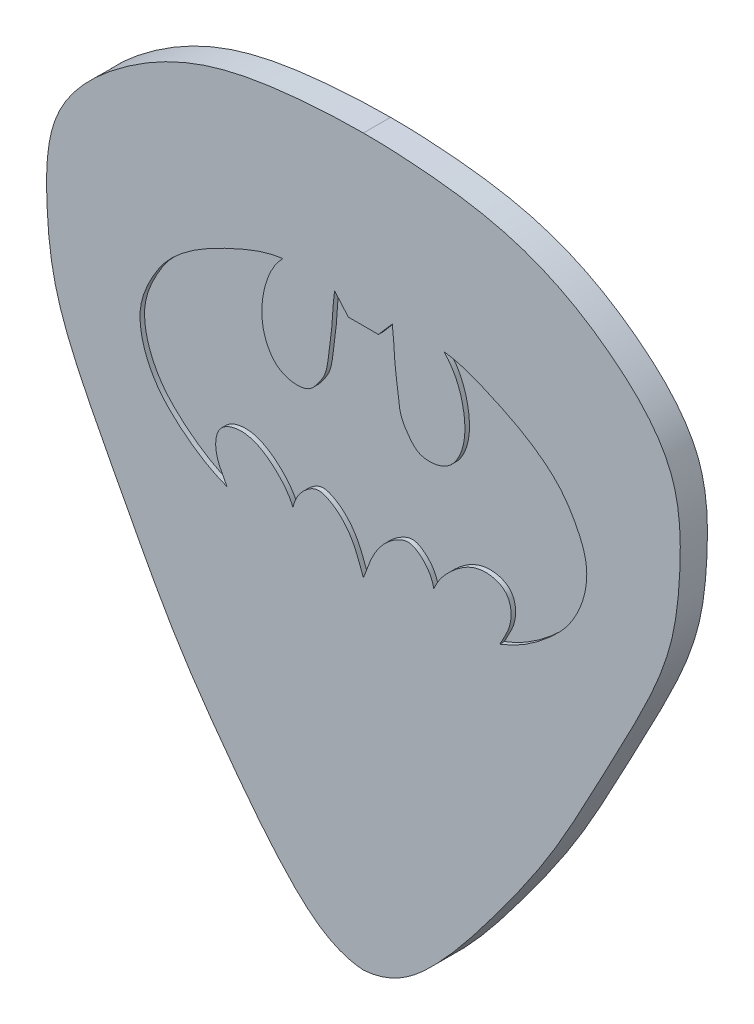
ISO-10303-21;
HEADER;
FILE_DESCRIPTION(('STEP AP214'),'2;1');
FILE_NAME('part.step','',(''),(''),'','','');
FILE_SCHEMA(('AUTOMOTIVE_DESIGN { 1 0 10303 214 1 1 1 1 }'));
ENDSEC;
DATA;
#1=APPLICATION_CONTEXT('core data for automotive mechanical design processes');
#2=APPLICATION_PROTOCOL_DEFINITION('international standard','automotive_design',2000,#1);
#3=PRODUCT_CONTEXT('',#1,'mechanical');
#4=PRODUCT('Part','Part','',(#3));
#5=PRODUCT_RELATED_PRODUCT_CATEGORY('part','',(#4));
#6=PRODUCT_DEFINITION_FORMATION('','',#4);
#7=PRODUCT_DEFINITION_CONTEXT('part definition',#1,'design');
#8=PRODUCT_DEFINITION('design','',#6,#7);
#9=PRODUCT_DEFINITION_SHAPE('','',#8);
#10=(LENGTH_UNIT() NAMED_UNIT(*) SI_UNIT(.MILLI.,.METRE.));
#11=(NAMED_UNIT(*) PLANE_ANGLE_UNIT() SI_UNIT($,.RADIAN.));
#12=(NAMED_UNIT(*) SI_UNIT($,.STERADIAN.) SOLID_ANGLE_UNIT());
#13=UNCERTAINTY_MEASURE_WITH_UNIT(LENGTH_MEASURE(1.E-05),#10,'distance_accuracy_value','');
#14=(GEOMETRIC_REPRESENTATION_CONTEXT(3) GLOBAL_UNCERTAINTY_ASSIGNED_CONTEXT((#13)) GLOBAL_UNIT_ASSIGNED_CONTEXT((#10,
#11,#12)) REPRESENTATION_CONTEXT('',''));
#15=CARTESIAN_POINT('',(0.,0.,0.));
#16=DIRECTION('',(0.,0.,1.));
#17=DIRECTION('',(1.,0.,0.));
#18=AXIS2_PLACEMENT_3D('',#15,#16,#17);
#19=CARTESIAN_POINT('',(13.2868793034782,18.3555837663293,1.2));
#20=DIRECTION('',(0.,0.,-1.));
#21=DIRECTION('',(-1.,0.,0.));
#22=AXIS2_PLACEMENT_3D('',#19,#20,#21);
#23=PLANE('',#22);
#24=CARTESIAN_POINT('',(0.,0.,1.2));
#25=CARTESIAN_POINT('',(1.3725179585471,0.0920720774433055,1.2));
#26=CARTESIAN_POINT('',(3.40311330723531,1.84725696244432,1.2));
#27=CARTESIAN_POINT('',(5.83377601303966,4.9969359267709,1.2));
#28=CARTESIAN_POINT('',(8.30396753302915,8.43054929060509,1.2));
#29=CARTESIAN_POINT('',(10.213558633326,12.0661802752507,1.2));
#30=CARTESIAN_POINT('',(12.1318717474483,15.6564896058509,1.2));
#31=CARTESIAN_POINT('',(13.6853638227223,18.9210740220786,1.2));
#32=CARTESIAN_POINT('',(14.0424116044245,22.4561533996481,1.2));
#33=CARTESIAN_POINT('',(13.9658646966753,26.1770084955899,1.2));
#34=CARTESIAN_POINT('',(10.9360646284182,29.231355796995,1.2));
#35=CARTESIAN_POINT('',(7.15224424947316,31.2979340239972,1.2));
#36=CARTESIAN_POINT('',(3.35647220863482,31.8876809648605,1.2));
#37=CARTESIAN_POINT('',(0.936664848006672,32.004023721527,1.2));
#38=CARTESIAN_POINT('',(0.,32.0024926417289,1.2));
#39=B_SPLINE_CURVE_WITH_KNOTS('',3,(#24,#25,#26,#27,#28,#29,#30,#31,#32,#33,#34,#35,#36,#37,
#38),.UNSPECIFIED.,.F.,.F.,(4,1,1,1,1,1,1,1,1,1,1,1,4),(0.,0.0676881194936068,0.135065153333643,
0.209958152721667,0.288697785846604,0.349864900651225,0.424267439940274,0.47494369953207,
0.536327458499454,0.610656572670228,0.68545271983875,0.761085883741637,0.810203958906233),.UNSPECIFIED.);
#40=CARTESIAN_POINT('',(0.,0.,1.2));
#41=VERTEX_POINT('',#40);
#42=CARTESIAN_POINT('',(0.,32.0024926417289,1.2));
#43=VERTEX_POINT('',#42);
#44=EDGE_CURVE('E239',#41,#43,#39,.T.);
#45=ORIENTED_EDGE('',*,*,#44,.T.);
#46=CARTESIAN_POINT('',(0.,32.0024926417289,1.2));
#47=CARTESIAN_POINT('',(-0.936664848006679,32.004023721527,1.2));
#48=CARTESIAN_POINT('',(-3.35647220863482,31.8876809648605,1.2));
#49=CARTESIAN_POINT('',(-7.15224424947317,31.2979340239972,1.2));
#50=CARTESIAN_POINT('',(-10.9360646284182,29.231355796995,1.2));
#51=CARTESIAN_POINT('',(-13.9658646966753,26.1770084955899,1.2));
#52=CARTESIAN_POINT('',(-14.0424116044245,22.4561533996481,1.2));
#53=CARTESIAN_POINT('',(-13.6853638227223,18.9210740220786,1.2));
#54=CARTESIAN_POINT('',(-12.1318717474483,15.6564896058509,1.2));
#55=CARTESIAN_POINT('',(-10.213558633326,12.0661802752507,1.2));
#56=CARTESIAN_POINT('',(-8.30396753302916,8.43054929060509,1.2));
#57=CARTESIAN_POINT('',(-5.83377601303966,4.99693592677089,1.2));
#58=CARTESIAN_POINT('',(-3.40311330723531,1.84725696244432,1.2));
#59=CARTESIAN_POINT('',(-1.3725179585471,0.0920720774433055,1.2));
#60=CARTESIAN_POINT('',(0.,0.,1.2));
#61=B_SPLINE_CURVE_WITH_KNOTS('',3,(#46,#47,#48,#49,#50,#51,#52,#53,#54,#55,#56,#57,#58,#59,
#60),.UNSPECIFIED.,.F.,.F.,(4,1,1,1,1,1,1,1,1,1,1,1,4),(0.,0.0491180751645952,0.124751239067483,
0.199547386236005,0.273876500406779,0.335260259374162,0.385936518965959,0.460339058255008,
0.521506173059629,0.600245806184565,0.67513880557259,0.742515839412626,0.810203958906233),.UNSPECIFIED.);
#62=EDGE_CURVE('E234',#43,#41,#61,.T.);
#63=ORIENTED_EDGE('',*,*,#62,.T.);
#64=EDGE_LOOP('',(#45,#63));
#65=FACE_BOUND('',#64,.T.);
#66=CARTESIAN_POINT('',(-6.02244065031324,15.4715929240688,1.2));
#67=CARTESIAN_POINT('',(-6.22301879709562,15.8459588998758,1.2));
#68=CARTESIAN_POINT('',(-6.61929835492738,16.4776579334196,1.2));
#69=CARTESIAN_POINT('',(-6.4405931468688,17.7051243432232,1.2));
#70=CARTESIAN_POINT('',(-5.3578247445418,18.0185956036552,1.2));
#71=CARTESIAN_POINT('',(-4.48411354140276,17.697804827242,1.2));
#72=CARTESIAN_POINT('',(-3.70329794364246,17.067396938081,1.2));
#73=CARTESIAN_POINT('',(-3.25809367833965,16.5215850809718,1.2));
#74=CARTESIAN_POINT('',(-3.10836533595793,16.121909166538,1.2));
#75=B_SPLINE_CURVE_WITH_KNOTS('',3,(#66,#67,#68,#69,#70,#71,#72,#73,#74),.UNSPECIFIED.,.F.,.F.,
(4,1,1,1,1,1,4),(0.,0.205854259329101,0.355134320336196,0.518085323207197,0.666937553174598,
0.795303167325571,1.),.UNSPECIFIED.);
#76=CARTESIAN_POINT('',(-6.02244065031324,15.4715929240688,1.2));
#77=VERTEX_POINT('',#76);
#78=CARTESIAN_POINT('',(-3.10836533595793,16.121909166538,1.2));
#79=VERTEX_POINT('',#78);
#80=EDGE_CURVE('E205',#77,#79,#75,.T.);
#81=ORIENTED_EDGE('',*,*,#80,.F.);
#82=CARTESIAN_POINT('',(-3.55243983808917,25.4257602621558,1.2));
#83=CARTESIAN_POINT('',(-4.1313237409946,25.3564185768113,1.2));
#84=CARTESIAN_POINT('',(-4.92529976751502,25.0847356962208,1.2));
#85=CARTESIAN_POINT('',(-5.95054575208411,24.6218943145963,1.2));
#86=CARTESIAN_POINT('',(-6.94315990572005,24.1382948794436,1.2));
#87=CARTESIAN_POINT('',(-7.9280658164995,23.5158759319057,1.2));
#88=CARTESIAN_POINT('',(-8.79594148055182,22.686186626457,1.2));
#89=CARTESIAN_POINT('',(-9.43265344454801,21.6947109070489,1.2));
#90=CARTESIAN_POINT('',(-9.93510109796278,20.5418108675264,1.2));
#91=CARTESIAN_POINT('',(-9.81974214193784,19.3491868494738,1.2));
#92=CARTESIAN_POINT('',(-9.49794069814803,18.4037750264193,1.2));
#93=CARTESIAN_POINT('',(-8.9761434724651,17.5520751749046,1.2));
#94=CARTESIAN_POINT('',(-7.85072243323037,16.4481756045646,1.2));
#95=CARTESIAN_POINT('',(-6.84357543950143,15.7774770030686,1.2));
#96=CARTESIAN_POINT('',(-6.02244065031324,15.4715929240688,1.2));
#97=B_SPLINE_CURVE_WITH_KNOTS('',3,(#82,#83,#84,#85,#86,#87,#88,#89,#90,#91,#92,#93,#94,#95,
#96),.UNSPECIFIED.,.F.,.F.,(4,1,1,1,1,1,1,1,1,1,1,1,4),(0.,0.114464816633258,0.165055863543866,
0.222504687994984,0.332841562793707,0.394026530237335,0.45800770000997,0.565829823981422,
0.633836882505996,0.689565343984703,0.762737099766238,0.828769581828576,1.),.UNSPECIFIED.);
#98=CARTESIAN_POINT('',(-3.55243983808917,25.4257602621558,1.2));
#99=VERTEX_POINT('',#98);
#100=EDGE_CURVE('E139',#99,#77,#97,.T.);
#101=ORIENTED_EDGE('',*,*,#100,.F.);
#102=CARTESIAN_POINT('',(-1.27392486420512,25.3375682970172,1.2));
#103=CARTESIAN_POINT('',(-1.34146744798834,24.8741810543016,1.2));
#104=CARTESIAN_POINT('',(-1.35280975333218,24.0275894025221,1.2));
#105=CARTESIAN_POINT('',(-1.52838933790248,22.8840468010994,1.2));
#106=CARTESIAN_POINT('',(-1.60898673186021,21.9936205078858,1.2));
#107=CARTESIAN_POINT('',(-2.00346270985034,21.4209922066139,1.2));
#108=CARTESIAN_POINT('',(-2.35667722538557,20.9641602571492,1.2));
#109=CARTESIAN_POINT('',(-3.0588147714844,20.8536578888809,1.2));
#110=CARTESIAN_POINT('',(-3.79559264534921,21.0783475680091,1.2));
#111=CARTESIAN_POINT('',(-4.30959211191261,21.8049039528985,1.2));
#112=CARTESIAN_POINT('',(-4.53007669674504,22.708479488169,1.2));
#113=CARTESIAN_POINT('',(-4.41448275053673,24.0210131562478,1.2));
#114=CARTESIAN_POINT('',(-4.01360843699971,24.9646550652986,1.2));
#115=CARTESIAN_POINT('',(-3.55243983808917,25.4257602621558,1.2));
#116=B_SPLINE_CURVE_WITH_KNOTS('',3,(#102,#103,#104,#105,#106,#107,#108,#109,#110,#111,#112,
#113,#114,#115),.UNSPECIFIED.,.F.,.F.,(4,1,1,1,1,1,1,1,1,1,1,4),(0.,0.131609133993092,
0.235936851986378,0.328168246784935,0.373910171744128,0.430745972127253,0.482425313130639,
0.562606571701551,0.634043740261748,0.721471282750536,0.819469906842683,1.),.UNSPECIFIED.);
#117=CARTESIAN_POINT('',(-1.27392486420512,25.3375682970172,1.2));
#118=VERTEX_POINT('',#117);
#119=EDGE_CURVE('E346',#118,#99,#116,.T.);
#120=ORIENTED_EDGE('',*,*,#119,.F.);
#121=DIRECTION('',(-0.654213662388365,0.756309780410384,0.));
#122=VECTOR('',#121,1.);
#123=CARTESIAN_POINT('',(-0.664457203701094,24.6329875476635,1.2));
#124=LINE('',#123,#122);
#125=CARTESIAN_POINT('',(-0.664457203701094,24.6329875476635,1.2));
#126=VERTEX_POINT('',#125);
#127=EDGE_CURVE('E344',#126,#118,#124,.T.);
#128=ORIENTED_EDGE('',*,*,#127,.F.);
#129=DIRECTION('',(-1.,0.,0.));
#130=VECTOR('',#129,1.);
#131=CARTESIAN_POINT('',(-0.664457203701094,24.6329875476635,1.2));
#132=LINE('',#131,#130);
#133=CARTESIAN_POINT('',(0.664457203701089,24.6329875476635,1.2));
#134=VERTEX_POINT('',#133);
#135=EDGE_CURVE('E342',#134,#126,#132,.T.);
#136=ORIENTED_EDGE('',*,*,#135,.F.);
#137=DIRECTION('',(-0.654213662388365,-0.756309780410384,0.));
#138=VECTOR('',#137,1.);
#139=CARTESIAN_POINT('',(0.664457203701089,24.6329875476635,1.2));
#140=LINE('',#139,#138);
#141=CARTESIAN_POINT('',(1.27392486420511,25.3375682970172,1.2));
#142=VERTEX_POINT('',#141);
#143=EDGE_CURVE('E337',#142,#134,#140,.T.);
#144=ORIENTED_EDGE('',*,*,#143,.F.);
#145=CARTESIAN_POINT('',(3.55243983808916,25.4257602621558,1.2));
#146=CARTESIAN_POINT('',(4.0136084369997,24.9646550652986,1.2));
#147=CARTESIAN_POINT('',(4.41448275053672,24.0210131562478,1.2));
#148=CARTESIAN_POINT('',(4.53007669674504,22.708479488169,1.2));
#149=CARTESIAN_POINT('',(4.3095921119126,21.8049039528985,1.2));
#150=CARTESIAN_POINT('',(3.79559264534921,21.0783475680091,1.2));
#151=CARTESIAN_POINT('',(3.0588147714844,20.8536578888809,1.2));
#152=CARTESIAN_POINT('',(2.35667722538557,20.9641602571492,1.2));
#153=CARTESIAN_POINT('',(2.00346270985034,21.4209922066139,1.2));
#154=CARTESIAN_POINT('',(1.60898673186021,21.9936205078858,1.2));
#155=CARTESIAN_POINT('',(1.52838933790247,22.8840468010994,1.2));
#156=CARTESIAN_POINT('',(1.35280975333217,24.0275894025221,1.2));
#157=CARTESIAN_POINT('',(1.34146744798833,24.8741810543016,1.2));
#158=CARTESIAN_POINT('',(1.27392486420511,25.3375682970172,1.2));
#159=B_SPLINE_CURVE_WITH_KNOTS('',3,(#145,#146,#147,#148,#149,#150,#151,#152,#153,#154,#155,
#156,#157,#158),.UNSPECIFIED.,.F.,.F.,(4,1,1,1,1,1,1,1,1,1,1,4),(0.,0.180530093157317,
0.278528717249464,0.365956259738252,0.437393428298449,0.517574686869361,0.569254027872747,
0.626089828255871,0.671831753215065,0.764063148013622,0.868390866006908,1.),.UNSPECIFIED.);
#160=CARTESIAN_POINT('',(3.55243983808916,25.4257602621558,1.2));
#161=VERTEX_POINT('',#160);
#162=EDGE_CURVE('E329',#161,#142,#159,.T.);
#163=ORIENTED_EDGE('',*,*,#162,.F.);
#164=CARTESIAN_POINT('',(6.02244065031324,15.4715929240688,1.2));
#165=CARTESIAN_POINT('',(6.84357543950143,15.7774770030686,1.2));
#166=CARTESIAN_POINT('',(7.85072243323037,16.4481756045646,1.2));
#167=CARTESIAN_POINT('',(8.9761434724651,17.5520751749046,1.2));
#168=CARTESIAN_POINT('',(9.49794069814803,18.4037750264193,1.2));
#169=CARTESIAN_POINT('',(9.81974214193784,19.3491868494738,1.2));
#170=CARTESIAN_POINT('',(9.93510109796278,20.5418108675265,1.2));
#171=CARTESIAN_POINT('',(9.432653444548,21.6947109070489,1.2));
#172=CARTESIAN_POINT('',(8.79594148055182,22.6861866264571,1.2));
#173=CARTESIAN_POINT('',(7.9280658164995,23.5158759319057,1.2));
#174=CARTESIAN_POINT('',(6.94315990572005,24.1382948794436,1.2));
#175=CARTESIAN_POINT('',(5.95054575208411,24.6218943145963,1.2));
#176=CARTESIAN_POINT('',(4.92529976751502,25.0847356962208,1.2));
#177=CARTESIAN_POINT('',(4.1313237409946,25.3564185768113,1.2));
#178=CARTESIAN_POINT('',(3.55243983808916,25.4257602621558,1.2));
#179=B_SPLINE_CURVE_WITH_KNOTS('',3,(#164,#165,#166,#167,#168,#169,#170,#171,#172,#173,#174,
#175,#176,#177,#178),.UNSPECIFIED.,.F.,.F.,(4,1,1,1,1,1,1,1,1,1,1,1,4),(0.,0.171230418171424,
0.237262900233762,0.310434656015297,0.366163117494004,0.434170176018578,0.54199229999003,
0.605973469762665,0.667158437206293,0.777495312005016,0.834944136456134,0.885535183366742,1.),.UNSPECIFIED.);
#180=CARTESIAN_POINT('',(6.02244065031324,15.4715929240688,1.2));
#181=VERTEX_POINT('',#180);
#182=EDGE_CURVE('E303',#181,#161,#179,.T.);
#183=ORIENTED_EDGE('',*,*,#182,.F.);
#184=CARTESIAN_POINT('',(3.10836533595793,16.121909166538,1.2));
#185=CARTESIAN_POINT('',(3.25809367833964,16.5215850809718,1.2));
#186=CARTESIAN_POINT('',(3.70329794364246,17.067396938081,1.2));
#187=CARTESIAN_POINT('',(4.48411354140276,17.697804827242,1.2));
#188=CARTESIAN_POINT('',(5.3578247445418,18.0185956036552,1.2));
#189=CARTESIAN_POINT('',(6.44059314686879,17.7051243432232,1.2));
#190=CARTESIAN_POINT('',(6.61929835492738,16.4776579334196,1.2));
#191=CARTESIAN_POINT('',(6.22301879709562,15.8459588998758,1.2));
#192=CARTESIAN_POINT('',(6.02244065031324,15.4715929240688,1.2));
#193=B_SPLINE_CURVE_WITH_KNOTS('',3,(#184,#185,#186,#187,#188,#189,#190,#191,#192),
.UNSPECIFIED.,.F.,.F.,(4,1,1,1,1,1,4),(0.,0.204696832674429,0.333062446825401,0.481914676792803,
0.644865679663804,0.794145740670898,1.),.UNSPECIFIED.);
#194=CARTESIAN_POINT('',(3.10836533595793,16.121909166538,1.2));
#195=VERTEX_POINT('',#194);
#196=EDGE_CURVE('E302',#195,#181,#193,.T.);
#197=ORIENTED_EDGE('',*,*,#196,.F.);
#198=CARTESIAN_POINT('',(0.,15.,1.2));
#199=CARTESIAN_POINT('',(0.146621275493468,15.3761725247231,1.2));
#200=CARTESIAN_POINT('',(0.356341854703002,16.0521402633316,1.2));
#201=CARTESIAN_POINT('',(0.916505855705359,16.8076563329359,1.2));
#202=CARTESIAN_POINT('',(1.45526805811014,17.2069945233295,1.2));
#203=CARTESIAN_POINT('',(2.03028813578742,17.432291197699,1.2));
#204=CARTESIAN_POINT('',(2.73115795863677,17.0131458887069,1.2));
#205=CARTESIAN_POINT('',(3.03938046134268,16.501937060555,1.2));
#206=CARTESIAN_POINT('',(3.10836533595793,16.121909166538,1.2));
#207=B_SPLINE_CURVE_WITH_KNOTS('',3,(#198,#199,#200,#201,#202,#203,#204,#205,#206),
.UNSPECIFIED.,.F.,.F.,(4,1,1,1,1,1,4),(0.,0.243462080200646,0.4229761756446,0.552795674685186,
0.649479592945795,0.7703993874957,1.),.UNSPECIFIED.);
#208=CARTESIAN_POINT('',(0.,15.,1.2));
#209=VERTEX_POINT('',#208);
#210=EDGE_CURVE('E300',#209,#195,#207,.T.);
#211=ORIENTED_EDGE('',*,*,#210,.F.);
#212=CARTESIAN_POINT('',(-3.10836533595793,16.121909166538,1.2));
#213=CARTESIAN_POINT('',(-3.03938046134269,16.501937060555,1.2));
#214=CARTESIAN_POINT('',(-2.73115795863677,17.0131458887069,1.2));
#215=CARTESIAN_POINT('',(-2.03028813578742,17.432291197699,1.2));
#216=CARTESIAN_POINT('',(-1.45526805811015,17.2069945233295,1.2));
#217=CARTESIAN_POINT('',(-0.916505855705361,16.8076563329359,1.2));
#218=CARTESIAN_POINT('',(-0.356341854702997,16.0521402633316,1.2));
#219=CARTESIAN_POINT('',(-0.146621275493466,15.3761725247231,1.2));
#220=CARTESIAN_POINT('',(0.,15.,1.2));
#221=B_SPLINE_CURVE_WITH_KNOTS('',3,(#212,#213,#214,#215,#216,#217,#218,#219,#220),
.UNSPECIFIED.,.F.,.F.,(4,1,1,1,1,1,4),(0.,0.2296006125043,0.350520407054205,0.447204325314814,
0.5770238243554,0.756537919799354,1.),.UNSPECIFIED.);
#222=EDGE_CURVE('E210',#79,#209,#221,.T.);
#223=ORIENTED_EDGE('',*,*,#222,.F.);
#224=EDGE_LOOP('',(#81,#101,#120,#128,#136,#144,#163,#183,#197,#211,#223));
#225=FACE_BOUND('',#224,.T.);
#226=ADVANCED_FACE('F32',(#65,#225),#23,.F.);
#227=CARTESIAN_POINT('',(13.2868793034782,18.3555837663293,0.));
#228=DIRECTION('',(0.,0.,-1.));
#229=DIRECTION('',(-1.,0.,0.));
#230=AXIS2_PLACEMENT_3D('',#227,#228,#229);
#231=PLANE('',#230);
#232=CARTESIAN_POINT('',(0.,0.,0.));
#233=CARTESIAN_POINT('',(1.3725179585471,0.0920720774433055,0.));
#234=CARTESIAN_POINT('',(3.40311330723531,1.84725696244432,0.));
#235=CARTESIAN_POINT('',(5.83377601303966,4.9969359267709,0.));
#236=CARTESIAN_POINT('',(8.30396753302915,8.43054929060509,0.));
#237=CARTESIAN_POINT('',(10.213558633326,12.0661802752507,0.));
#238=CARTESIAN_POINT('',(12.1318717474483,15.6564896058509,0.));
#239=CARTESIAN_POINT('',(13.6853638227223,18.9210740220786,0.));
#240=CARTESIAN_POINT('',(14.0424116044245,22.4561533996481,0.));
#241=CARTESIAN_POINT('',(13.9658646966753,26.1770084955899,0.));
#242=CARTESIAN_POINT('',(10.9360646284182,29.231355796995,0.));
#243=CARTESIAN_POINT('',(7.15224424947316,31.2979340239972,0.));
#244=CARTESIAN_POINT('',(3.35647220863482,31.8876809648605,0.));
#245=CARTESIAN_POINT('',(0.936664848006672,32.004023721527,0.));
#246=CARTESIAN_POINT('',(0.,32.0024926417289,0.));
#247=B_SPLINE_CURVE_WITH_KNOTS('',3,(#232,#233,#234,#235,#236,#237,#238,#239,#240,#241,#242,
#243,#244,#245,#246),.UNSPECIFIED.,.F.,.F.,(4,1,1,1,1,1,1,1,1,1,1,1,4),(0.,0.0676881194936068,
0.135065153333643,0.209958152721667,0.288697785846604,0.349864900651225,0.424267439940274,
0.47494369953207,0.536327458499454,0.610656572670228,0.68545271983875,0.761085883741637,
0.810203958906233),.UNSPECIFIED.);
#248=CARTESIAN_POINT('',(0.,0.,0.));
#249=VERTEX_POINT('',#248);
#250=CARTESIAN_POINT('',(0.,32.0024926417289,0.));
#251=VERTEX_POINT('',#250);
#252=EDGE_CURVE('E244',#249,#251,#247,.T.);
#253=ORIENTED_EDGE('',*,*,#252,.F.);
#254=CARTESIAN_POINT('',(0.,32.0024926417289,0.));
#255=CARTESIAN_POINT('',(-0.936664848006679,32.004023721527,0.));
#256=CARTESIAN_POINT('',(-3.35647220863482,31.8876809648605,0.));
#257=CARTESIAN_POINT('',(-7.15224424947317,31.2979340239972,0.));
#258=CARTESIAN_POINT('',(-10.9360646284182,29.231355796995,0.));
#259=CARTESIAN_POINT('',(-13.9658646966753,26.1770084955899,0.));
#260=CARTESIAN_POINT('',(-14.0424116044245,22.4561533996481,0.));
#261=CARTESIAN_POINT('',(-13.6853638227223,18.9210740220786,0.));
#262=CARTESIAN_POINT('',(-12.1318717474483,15.6564896058509,0.));
#263=CARTESIAN_POINT('',(-10.213558633326,12.0661802752507,0.));
#264=CARTESIAN_POINT('',(-8.30396753302916,8.43054929060509,0.));
#265=CARTESIAN_POINT('',(-5.83377601303966,4.99693592677089,0.));
#266=CARTESIAN_POINT('',(-3.40311330723531,1.84725696244432,0.));
#267=CARTESIAN_POINT('',(-1.3725179585471,0.0920720774433055,0.));
#268=CARTESIAN_POINT('',(0.,0.,0.));
#269=B_SPLINE_CURVE_WITH_KNOTS('',3,(#254,#255,#256,#257,#258,#259,#260,#261,#262,#263,#264,
#265,#266,#267,#268),.UNSPECIFIED.,.F.,.F.,(4,1,1,1,1,1,1,1,1,1,1,1,4),(0.,0.0491180751645952,
0.124751239067483,0.199547386236005,0.273876500406779,0.335260259374162,0.385936518965959,
0.460339058255008,0.521506173059629,0.600245806184565,0.67513880557259,0.742515839412626,
0.810203958906233),.UNSPECIFIED.);
#270=EDGE_CURVE('E252',#251,#249,#269,.T.);
#271=ORIENTED_EDGE('',*,*,#270,.F.);
#272=EDGE_LOOP('',(#253,#271));
#273=FACE_BOUND('',#272,.T.);
#274=ADVANCED_FACE('F227',(#273),#231,.T.);
#275=DIRECTION('',(0.,0.,-1.));
#276=VECTOR('',#275,1.);
#277=SURFACE_OF_LINEAR_EXTRUSION('',#39,#276);
#278=ORIENTED_EDGE('',*,*,#252,.T.);
#279=DIRECTION('',(0.,0.,-1.));
#280=VECTOR('',#279,1.);
#281=CARTESIAN_POINT('',(0.,32.0024926417289,1.2));
#282=LINE('',#281,#280);
#283=EDGE_CURVE('E11',#43,#251,#282,.T.);
#284=ORIENTED_EDGE('',*,*,#283,.F.);
#285=ORIENTED_EDGE('',*,*,#44,.F.);
#286=DIRECTION('',(0.,0.,-1.));
#287=VECTOR('',#286,1.);
#288=CARTESIAN_POINT('',(0.,0.,1.2));
#289=LINE('',#288,#287);
#290=EDGE_CURVE('E42',#41,#249,#289,.T.);
#291=ORIENTED_EDGE('',*,*,#290,.T.);
#292=EDGE_LOOP('',(#278,#284,#285,#291));
#293=FACE_BOUND('',#292,.T.);
#294=ADVANCED_FACE('F34',(#293),#277,.F.);
#295=DIRECTION('',(0.,0.,-1.));
#296=VECTOR('',#295,1.);
#297=SURFACE_OF_LINEAR_EXTRUSION('',#61,#296);
#298=ORIENTED_EDGE('',*,*,#270,.T.);
#299=ORIENTED_EDGE('',*,*,#290,.F.);
#300=ORIENTED_EDGE('',*,*,#62,.F.);
#301=ORIENTED_EDGE('',*,*,#283,.T.);
#302=EDGE_LOOP('',(#298,#299,#300,#301));
#303=FACE_BOUND('',#302,.T.);
#304=ADVANCED_FACE('F223',(#303),#297,.F.);
#305=DIRECTION('',(0.,0.,-1.));
#306=VECTOR('',#305,1.);
#307=SURFACE_OF_LINEAR_EXTRUSION('',#75,#306);
#308=CARTESIAN_POINT('',(-6.02244065031324,15.4715929240688,1.));
#309=CARTESIAN_POINT('',(-6.22301879709562,15.8459588998758,1.));
#310=CARTESIAN_POINT('',(-6.61929835492738,16.4776579334196,1.));
#311=CARTESIAN_POINT('',(-6.4405931468688,17.7051243432232,1.));
#312=CARTESIAN_POINT('',(-5.3578247445418,18.0185956036552,1.));
#313=CARTESIAN_POINT('',(-4.48411354140276,17.697804827242,1.));
#314=CARTESIAN_POINT('',(-3.70329794364246,17.067396938081,1.));
#315=CARTESIAN_POINT('',(-3.25809367833965,16.5215850809718,1.));
#316=CARTESIAN_POINT('',(-3.10836533595793,16.121909166538,1.));
#317=B_SPLINE_CURVE_WITH_KNOTS('',3,(#308,#309,#310,#311,#312,#313,#314,#315,#316),
.UNSPECIFIED.,.F.,.F.,(4,1,1,1,1,1,4),(0.,0.205854259329101,0.355134320336196,0.518085323207197,
0.666937553174598,0.795303167325571,1.),.UNSPECIFIED.);
#318=CARTESIAN_POINT('',(-6.02244065031324,15.4715929240688,1.));
#319=VERTEX_POINT('',#318);
#320=CARTESIAN_POINT('',(-3.10836533595793,16.121909166538,1.));
#321=VERTEX_POINT('',#320);
#322=EDGE_CURVE('E145',#319,#321,#317,.T.);
#323=ORIENTED_EDGE('',*,*,#322,.F.);
#324=DIRECTION('',(0.,0.,-1.));
#325=VECTOR('',#324,1.);
#326=CARTESIAN_POINT('',(-6.02244065031324,15.4715929240688,1.2));
#327=LINE('',#326,#325);
#328=EDGE_CURVE('E132',#77,#319,#327,.T.);
#329=ORIENTED_EDGE('',*,*,#328,.F.);
#330=ORIENTED_EDGE('',*,*,#80,.T.);
#331=DIRECTION('',(0.,0.,-1.));
#332=VECTOR('',#331,1.);
#333=CARTESIAN_POINT('',(-3.10836533595793,16.121909166538,1.2));
#334=LINE('',#333,#332);
#335=EDGE_CURVE('E147',#79,#321,#334,.T.);
#336=ORIENTED_EDGE('',*,*,#335,.T.);
#337=EDGE_LOOP('',(#323,#329,#330,#336));
#338=FACE_BOUND('',#337,.T.);
#339=ADVANCED_FACE('F146',(#338),#307,.T.);
#340=DIRECTION('',(0.,0.,-1.));
#341=VECTOR('',#340,1.);
#342=SURFACE_OF_LINEAR_EXTRUSION('',#221,#341);
#343=CARTESIAN_POINT('',(-3.10836533595793,16.121909166538,1.));
#344=CARTESIAN_POINT('',(-3.03938046134269,16.501937060555,1.));
#345=CARTESIAN_POINT('',(-2.73115795863677,17.0131458887069,1.));
#346=CARTESIAN_POINT('',(-2.03028813578742,17.432291197699,1.));
#347=CARTESIAN_POINT('',(-1.45526805811015,17.2069945233295,1.));
#348=CARTESIAN_POINT('',(-0.916505855705361,16.8076563329359,1.));
#349=CARTESIAN_POINT('',(-0.356341854702997,16.0521402633316,1.));
#350=CARTESIAN_POINT('',(-0.146621275493466,15.3761725247231,1.));
#351=CARTESIAN_POINT('',(0.,15.,1.));
#352=B_SPLINE_CURVE_WITH_KNOTS('',3,(#343,#344,#345,#346,#347,#348,#349,#350,#351),
.UNSPECIFIED.,.F.,.F.,(4,1,1,1,1,1,4),(0.,0.2296006125043,0.350520407054205,0.447204325314814,
0.5770238243554,0.756537919799354,1.),.UNSPECIFIED.);
#353=CARTESIAN_POINT('',(0.,15.,1.));
#354=VERTEX_POINT('',#353);
#355=EDGE_CURVE('E50',#321,#354,#352,.T.);
#356=ORIENTED_EDGE('',*,*,#355,.F.);
#357=ORIENTED_EDGE('',*,*,#335,.F.);
#358=ORIENTED_EDGE('',*,*,#222,.T.);
#359=DIRECTION('',(0.,0.,-1.));
#360=VECTOR('',#359,1.);
#361=CARTESIAN_POINT('',(0.,15.,1.2));
#362=LINE('',#361,#360);
#363=EDGE_CURVE('E288',#209,#354,#362,.T.);
#364=ORIENTED_EDGE('',*,*,#363,.T.);
#365=EDGE_LOOP('',(#356,#357,#358,#364));
#366=FACE_BOUND('',#365,.T.);
#367=ADVANCED_FACE('F222',(#366),#342,.T.);
#368=DIRECTION('',(0.,0.,-1.));
#369=VECTOR('',#368,1.);
#370=SURFACE_OF_LINEAR_EXTRUSION('',#207,#369);
#371=CARTESIAN_POINT('',(3.10836533595793,16.121909166538,1.));
#372=CARTESIAN_POINT('',(3.03938046134268,16.501937060555,1.));
#373=CARTESIAN_POINT('',(2.73115795863677,17.0131458887069,1.));
#374=CARTESIAN_POINT('',(2.03028813578742,17.432291197699,1.));
#375=CARTESIAN_POINT('',(1.45526805811014,17.2069945233295,1.));
#376=CARTESIAN_POINT('',(0.916505855705359,16.8076563329359,1.));
#377=CARTESIAN_POINT('',(0.356341854703002,16.0521402633316,1.));
#378=CARTESIAN_POINT('',(0.146621275493468,15.3761725247231,1.));
#379=CARTESIAN_POINT('',(0.,15.,1.));
#380=B_SPLINE_CURVE_WITH_KNOTS('',3,(#371,#372,#373,#374,#375,#376,#377,#378,#379),
.UNSPECIFIED.,.F.,.F.,(4,1,1,1,1,1,4),(0.,0.2296006125043,0.350520407054205,0.447204325314814,
0.5770238243554,0.756537919799354,1.),.UNSPECIFIED.);
#381=CARTESIAN_POINT('',(3.10836533595793,16.121909166538,1.));
#382=VERTEX_POINT('',#381);
#383=EDGE_CURVE('E58',#382,#354,#380,.T.);
#384=ORIENTED_EDGE('',*,*,#383,.T.);
#385=ORIENTED_EDGE('',*,*,#363,.F.);
#386=ORIENTED_EDGE('',*,*,#210,.T.);
#387=DIRECTION('',(0.,0.,-1.));
#388=VECTOR('',#387,1.);
#389=CARTESIAN_POINT('',(3.10836533595793,16.121909166538,1.2));
#390=LINE('',#389,#388);
#391=EDGE_CURVE('E286',#195,#382,#390,.T.);
#392=ORIENTED_EDGE('',*,*,#391,.T.);
#393=EDGE_LOOP('',(#384,#385,#386,#392));
#394=FACE_BOUND('',#393,.T.);
#395=ADVANCED_FACE('F299',(#394),#370,.T.);
#396=DIRECTION('',(0.,0.,-1.));
#397=VECTOR('',#396,1.);
#398=SURFACE_OF_LINEAR_EXTRUSION('',#193,#397);
#399=CARTESIAN_POINT('',(6.02244065031324,15.4715929240688,1.));
#400=CARTESIAN_POINT('',(6.22301879709562,15.8459588998758,1.));
#401=CARTESIAN_POINT('',(6.61929835492738,16.4776579334196,1.));
#402=CARTESIAN_POINT('',(6.44059314686879,17.7051243432232,1.));
#403=CARTESIAN_POINT('',(5.3578247445418,18.0185956036552,1.));
#404=CARTESIAN_POINT('',(4.48411354140276,17.697804827242,1.));
#405=CARTESIAN_POINT('',(3.70329794364246,17.067396938081,1.));
#406=CARTESIAN_POINT('',(3.25809367833964,16.5215850809718,1.));
#407=CARTESIAN_POINT('',(3.10836533595793,16.121909166538,1.));
#408=B_SPLINE_CURVE_WITH_KNOTS('',3,(#399,#400,#401,#402,#403,#404,#405,#406,#407),
.UNSPECIFIED.,.F.,.F.,(4,1,1,1,1,1,4),(0.,0.205854259329102,0.355134320336196,0.518085323207197,
0.666937553174599,0.795303167325571,1.),.UNSPECIFIED.);
#409=CARTESIAN_POINT('',(6.02244065031324,15.4715929240688,1.));
#410=VERTEX_POINT('',#409);
#411=EDGE_CURVE('E177',#410,#382,#408,.T.);
#412=ORIENTED_EDGE('',*,*,#411,.T.);
#413=ORIENTED_EDGE('',*,*,#391,.F.);
#414=ORIENTED_EDGE('',*,*,#196,.T.);
#415=DIRECTION('',(0.,0.,-1.));
#416=VECTOR('',#415,1.);
#417=CARTESIAN_POINT('',(6.02244065031324,15.4715929240688,1.2));
#418=LINE('',#417,#416);
#419=EDGE_CURVE('E283',#181,#410,#418,.T.);
#420=ORIENTED_EDGE('',*,*,#419,.T.);
#421=EDGE_LOOP('',(#412,#413,#414,#420));
#422=FACE_BOUND('',#421,.T.);
#423=ADVANCED_FACE('F296',(#422),#398,.T.);
#424=DIRECTION('',(0.,0.,-1.));
#425=VECTOR('',#424,1.);
#426=SURFACE_OF_LINEAR_EXTRUSION('',#179,#425);
#427=CARTESIAN_POINT('',(3.55243983808916,25.4257602621558,1.));
#428=CARTESIAN_POINT('',(4.1313237409946,25.3564185768113,1.));
#429=CARTESIAN_POINT('',(4.92529976751502,25.0847356962208,1.));
#430=CARTESIAN_POINT('',(5.95054575208411,24.6218943145963,1.));
#431=CARTESIAN_POINT('',(6.94315990572005,24.1382948794436,1.));
#432=CARTESIAN_POINT('',(7.9280658164995,23.5158759319057,1.));
#433=CARTESIAN_POINT('',(8.79594148055182,22.6861866264571,1.));
#434=CARTESIAN_POINT('',(9.432653444548,21.6947109070489,1.));
#435=CARTESIAN_POINT('',(9.93510109796278,20.5418108675265,1.));
#436=CARTESIAN_POINT('',(9.81974214193784,19.3491868494738,1.));
#437=CARTESIAN_POINT('',(9.49794069814803,18.4037750264193,1.));
#438=CARTESIAN_POINT('',(8.9761434724651,17.5520751749046,1.));
#439=CARTESIAN_POINT('',(7.85072243323037,16.4481756045646,1.));
#440=CARTESIAN_POINT('',(6.84357543950143,15.7774770030686,1.));
#441=CARTESIAN_POINT('',(6.02244065031324,15.4715929240688,1.));
#442=B_SPLINE_CURVE_WITH_KNOTS('',3,(#427,#428,#429,#430,#431,#432,#433,#434,#435,#436,#437,
#438,#439,#440,#441),.UNSPECIFIED.,.F.,.F.,(4,1,1,1,1,1,1,1,1,1,1,1,4),(0.,0.114464816633258,
0.165055863543866,0.222504687994984,0.332841562793707,0.394026530237335,0.45800770000997,
0.565829823981422,0.633836882505996,0.689565343984703,0.762737099766238,0.828769581828576,1.),.UNSPECIFIED.);
#443=CARTESIAN_POINT('',(3.55243983808916,25.4257602621558,1.));
#444=VERTEX_POINT('',#443);
#445=EDGE_CURVE('E184',#444,#410,#442,.T.);
#446=ORIENTED_EDGE('',*,*,#445,.T.);
#447=ORIENTED_EDGE('',*,*,#419,.F.);
#448=ORIENTED_EDGE('',*,*,#182,.T.);
#449=DIRECTION('',(0.,0.,-1.));
#450=VECTOR('',#449,1.);
#451=CARTESIAN_POINT('',(3.55243983808916,25.4257602621558,1.2));
#452=LINE('',#451,#450);
#453=EDGE_CURVE('E280',#161,#444,#452,.T.);
#454=ORIENTED_EDGE('',*,*,#453,.T.);
#455=EDGE_LOOP('',(#446,#447,#448,#454));
#456=FACE_BOUND('',#455,.T.);
#457=ADVANCED_FACE('F319',(#456),#426,.T.);
#458=DIRECTION('',(0.,0.,-1.));
#459=VECTOR('',#458,1.);
#460=SURFACE_OF_LINEAR_EXTRUSION('',#159,#459);
#461=CARTESIAN_POINT('',(1.27392486420511,25.3375682970172,1.));
#462=CARTESIAN_POINT('',(1.34146744798833,24.8741810543016,1.));
#463=CARTESIAN_POINT('',(1.35280975333217,24.0275894025221,1.));
#464=CARTESIAN_POINT('',(1.52838933790247,22.8840468010994,1.));
#465=CARTESIAN_POINT('',(1.60898673186021,21.9936205078858,1.));
#466=CARTESIAN_POINT('',(2.00346270985034,21.4209922066139,1.));
#467=CARTESIAN_POINT('',(2.35667722538557,20.9641602571492,1.));
#468=CARTESIAN_POINT('',(3.0588147714844,20.8536578888809,1.));
#469=CARTESIAN_POINT('',(3.79559264534921,21.0783475680091,1.));
#470=CARTESIAN_POINT('',(4.3095921119126,21.8049039528985,1.));
#471=CARTESIAN_POINT('',(4.53007669674504,22.708479488169,1.));
#472=CARTESIAN_POINT('',(4.41448275053672,24.0210131562478,1.));
#473=CARTESIAN_POINT('',(4.0136084369997,24.9646550652986,1.));
#474=CARTESIAN_POINT('',(3.55243983808916,25.4257602621558,1.));
#475=B_SPLINE_CURVE_WITH_KNOTS('',3,(#461,#462,#463,#464,#465,#466,#467,#468,#469,#470,#471,
#472,#473,#474),.UNSPECIFIED.,.F.,.F.,(4,1,1,1,1,1,1,1,1,1,1,4),(0.,0.131609133993092,
0.235936851986378,0.328168246784935,0.373910171744129,0.430745972127253,0.482425313130639,
0.562606571701551,0.634043740261748,0.721471282750536,0.819469906842683,1.),.UNSPECIFIED.);
#476=CARTESIAN_POINT('',(1.27392486420511,25.3375682970172,1.));
#477=VERTEX_POINT('',#476);
#478=EDGE_CURVE('E191',#477,#444,#475,.T.);
#479=ORIENTED_EDGE('',*,*,#478,.T.);
#480=ORIENTED_EDGE('',*,*,#453,.F.);
#481=ORIENTED_EDGE('',*,*,#162,.T.);
#482=DIRECTION('',(0.,0.,-1.));
#483=VECTOR('',#482,1.);
#484=CARTESIAN_POINT('',(1.27392486420511,25.3375682970172,1.2));
#485=LINE('',#484,#483);
#486=EDGE_CURVE('E277',#142,#477,#485,.T.);
#487=ORIENTED_EDGE('',*,*,#486,.T.);
#488=EDGE_LOOP('',(#479,#480,#481,#487));
#489=FACE_BOUND('',#488,.T.);
#490=ADVANCED_FACE('F322',(#489),#460,.T.);
#491=CARTESIAN_POINT('',(0.664457203701089,24.6329875476635,1.2));
#492=DIRECTION('',(0.756309780410384,-0.654213662388365,0.));
#493=DIRECTION('',(0.654213662388365,0.756309780410384,0.));
#494=AXIS2_PLACEMENT_3D('',#491,#492,#493);
#495=PLANE('',#494);
#496=DIRECTION('',(0.654213662388365,0.756309780410384,0.));
#497=VECTOR('',#496,1.);
#498=CARTESIAN_POINT('',(-11.8080388561625,10.2140426394096,1.));
#499=LINE('',#498,#497);
#500=CARTESIAN_POINT('',(0.664457203701089,24.6329875476635,1.));
#501=VERTEX_POINT('',#500);
#502=EDGE_CURVE('E198',#501,#477,#499,.T.);
#503=ORIENTED_EDGE('',*,*,#502,.T.);
#504=ORIENTED_EDGE('',*,*,#486,.F.);
#505=ORIENTED_EDGE('',*,*,#143,.T.);
#506=DIRECTION('',(0.,0.,-1.));
#507=VECTOR('',#506,1.);
#508=CARTESIAN_POINT('',(0.664457203701089,24.6329875476635,1.2));
#509=LINE('',#508,#507);
#510=EDGE_CURVE('E274',#134,#501,#509,.T.);
#511=ORIENTED_EDGE('',*,*,#510,.T.);
#512=EDGE_LOOP('',(#503,#504,#505,#511));
#513=FACE_BOUND('',#512,.T.);
#514=ADVANCED_FACE('F371',(#513),#495,.T.);
#515=CARTESIAN_POINT('',(-0.664457203701094,24.6329875476635,1.2));
#516=DIRECTION('',(0.,-1.,0.));
#517=DIRECTION('',(0.,0.,-1.));
#518=AXIS2_PLACEMENT_3D('',#515,#516,#517);
#519=PLANE('',#518);
#520=DIRECTION('',(1.,0.,0.));
#521=VECTOR('',#520,1.);
#522=CARTESIAN_POINT('',(0.,24.6329875476635,1.));
#523=LINE('',#522,#521);
#524=CARTESIAN_POINT('',(-0.664457203701094,24.6329875476635,1.));
#525=VERTEX_POINT('',#524);
#526=EDGE_CURVE('E203',#525,#501,#523,.T.);
#527=ORIENTED_EDGE('',*,*,#526,.T.);
#528=ORIENTED_EDGE('',*,*,#510,.F.);
#529=ORIENTED_EDGE('',*,*,#135,.T.);
#530=DIRECTION('',(0.,0.,-1.));
#531=VECTOR('',#530,1.);
#532=CARTESIAN_POINT('',(-0.664457203701094,24.6329875476635,1.2));
#533=LINE('',#532,#531);
#534=EDGE_CURVE('E267',#126,#525,#533,.T.);
#535=ORIENTED_EDGE('',*,*,#534,.T.);
#536=EDGE_LOOP('',(#527,#528,#529,#535));
#537=FACE_BOUND('',#536,.T.);
#538=ADVANCED_FACE('F368',(#537),#519,.T.);
#539=CARTESIAN_POINT('',(-0.664457203701094,24.6329875476635,1.2));
#540=DIRECTION('',(-0.756309780410384,-0.654213662388365,0.));
#541=DIRECTION('',(0.654213662388365,-0.756309780410384,0.));
#542=AXIS2_PLACEMENT_3D('',#539,#540,#541);
#543=PLANE('',#542);
#544=DIRECTION('',(-0.654213662388365,0.756309780410384,0.));
#545=VECTOR('',#544,1.);
#546=CARTESIAN_POINT('',(11.8080388561625,10.2140426394096,1.));
#547=LINE('',#546,#545);
#548=CARTESIAN_POINT('',(-1.27392486420512,25.3375682970172,1.));
#549=VERTEX_POINT('',#548);
#550=EDGE_CURVE('E155',#525,#549,#547,.T.);
#551=ORIENTED_EDGE('',*,*,#550,.F.);
#552=ORIENTED_EDGE('',*,*,#534,.F.);
#553=ORIENTED_EDGE('',*,*,#127,.T.);
#554=DIRECTION('',(0.,0.,-1.));
#555=VECTOR('',#554,1.);
#556=CARTESIAN_POINT('',(-1.27392486420512,25.3375682970172,1.2));
#557=LINE('',#556,#555);
#558=EDGE_CURVE('E264',#118,#549,#557,.T.);
#559=ORIENTED_EDGE('',*,*,#558,.T.);
#560=EDGE_LOOP('',(#551,#552,#553,#559));
#561=FACE_BOUND('',#560,.T.);
#562=ADVANCED_FACE('F363',(#561),#543,.T.);
#563=DIRECTION('',(0.,0.,-1.));
#564=VECTOR('',#563,1.);
#565=SURFACE_OF_LINEAR_EXTRUSION('',#116,#564);
#566=CARTESIAN_POINT('',(-1.27392486420512,25.3375682970172,1.));
#567=CARTESIAN_POINT('',(-1.34146744798834,24.8741810543016,1.));
#568=CARTESIAN_POINT('',(-1.35280975333218,24.0275894025221,1.));
#569=CARTESIAN_POINT('',(-1.52838933790248,22.8840468010994,1.));
#570=CARTESIAN_POINT('',(-1.60898673186021,21.9936205078858,1.));
#571=CARTESIAN_POINT('',(-2.00346270985034,21.4209922066139,1.));
#572=CARTESIAN_POINT('',(-2.35667722538557,20.9641602571492,1.));
#573=CARTESIAN_POINT('',(-3.0588147714844,20.8536578888809,1.));
#574=CARTESIAN_POINT('',(-3.79559264534921,21.0783475680091,1.));
#575=CARTESIAN_POINT('',(-4.30959211191261,21.8049039528985,1.));
#576=CARTESIAN_POINT('',(-4.53007669674504,22.708479488169,1.));
#577=CARTESIAN_POINT('',(-4.41448275053673,24.0210131562478,1.));
#578=CARTESIAN_POINT('',(-4.01360843699971,24.9646550652986,1.));
#579=CARTESIAN_POINT('',(-3.55243983808917,25.4257602621558,1.));
#580=B_SPLINE_CURVE_WITH_KNOTS('',3,(#566,#567,#568,#569,#570,#571,#572,#573,#574,#575,#576,
#577,#578,#579),.UNSPECIFIED.,.F.,.F.,(4,1,1,1,1,1,1,1,1,1,1,4),(0.,0.131609133993092,
0.235936851986378,0.328168246784935,0.373910171744128,0.430745972127253,0.482425313130639,
0.562606571701551,0.634043740261748,0.721471282750536,0.819469906842683,1.),.UNSPECIFIED.);
#581=CARTESIAN_POINT('',(-3.55243983808917,25.4257602621558,1.));
#582=VERTEX_POINT('',#581);
#583=EDGE_CURVE('E153',#549,#582,#580,.T.);
#584=ORIENTED_EDGE('',*,*,#583,.F.);
#585=ORIENTED_EDGE('',*,*,#558,.F.);
#586=ORIENTED_EDGE('',*,*,#119,.T.);
#587=DIRECTION('',(0.,0.,-1.));
#588=VECTOR('',#587,1.);
#589=CARTESIAN_POINT('',(-3.55243983808917,25.4257602621558,1.2));
#590=LINE('',#589,#588);
#591=EDGE_CURVE('E142',#99,#582,#590,.T.);
#592=ORIENTED_EDGE('',*,*,#591,.T.);
#593=EDGE_LOOP('',(#584,#585,#586,#592));
#594=FACE_BOUND('',#593,.T.);
#595=ADVANCED_FACE('F359',(#594),#565,.T.);
#596=DIRECTION('',(0.,0.,-1.));
#597=VECTOR('',#596,1.);
#598=SURFACE_OF_LINEAR_EXTRUSION('',#97,#597);
#599=CARTESIAN_POINT('',(-3.55243983808917,25.4257602621558,1.));
#600=CARTESIAN_POINT('',(-4.1313237409946,25.3564185768113,1.));
#601=CARTESIAN_POINT('',(-4.92529976751502,25.0847356962208,1.));
#602=CARTESIAN_POINT('',(-5.95054575208411,24.6218943145963,1.));
#603=CARTESIAN_POINT('',(-6.94315990572005,24.1382948794436,1.));
#604=CARTESIAN_POINT('',(-7.9280658164995,23.5158759319057,1.));
#605=CARTESIAN_POINT('',(-8.79594148055182,22.686186626457,1.));
#606=CARTESIAN_POINT('',(-9.43265344454801,21.6947109070489,1.));
#607=CARTESIAN_POINT('',(-9.93510109796278,20.5418108675264,1.));
#608=CARTESIAN_POINT('',(-9.81974214193784,19.3491868494738,1.));
#609=CARTESIAN_POINT('',(-9.49794069814803,18.4037750264193,1.));
#610=CARTESIAN_POINT('',(-8.9761434724651,17.5520751749046,1.));
#611=CARTESIAN_POINT('',(-7.85072243323037,16.4481756045646,1.));
#612=CARTESIAN_POINT('',(-6.84357543950143,15.7774770030686,1.));
#613=CARTESIAN_POINT('',(-6.02244065031324,15.4715929240688,1.));
#614=B_SPLINE_CURVE_WITH_KNOTS('',3,(#599,#600,#601,#602,#603,#604,#605,#606,#607,#608,#609,
#610,#611,#612,#613),.UNSPECIFIED.,.F.,.F.,(4,1,1,1,1,1,1,1,1,1,1,1,4),(0.,0.114464816633258,
0.165055863543866,0.222504687994984,0.332841562793707,0.394026530237335,0.45800770000997,
0.565829823981422,0.633836882505996,0.689565343984703,0.762737099766238,0.828769581828576,1.),.UNSPECIFIED.);
#615=EDGE_CURVE('E136',#582,#319,#614,.T.);
#616=ORIENTED_EDGE('',*,*,#615,.F.);
#617=ORIENTED_EDGE('',*,*,#591,.F.);
#618=ORIENTED_EDGE('',*,*,#100,.T.);
#619=ORIENTED_EDGE('',*,*,#328,.T.);
#620=EDGE_LOOP('',(#616,#617,#618,#619));
#621=FACE_BOUND('',#620,.T.);
#622=ADVANCED_FACE('F134',(#621),#598,.T.);
#623=CARTESIAN_POINT('',(0.,0.,1.));
#624=DIRECTION('',(0.,0.,1.));
#625=DIRECTION('',(1.,0.,0.));
#626=AXIS2_PLACEMENT_3D('',#623,#624,#625);
#627=PLANE('',#626);
#628=ORIENTED_EDGE('',*,*,#550,.T.);
#629=ORIENTED_EDGE('',*,*,#583,.T.);
#630=ORIENTED_EDGE('',*,*,#615,.T.);
#631=ORIENTED_EDGE('',*,*,#322,.T.);
#632=ORIENTED_EDGE('',*,*,#355,.T.);
#633=ORIENTED_EDGE('',*,*,#383,.F.);
#634=ORIENTED_EDGE('',*,*,#411,.F.);
#635=ORIENTED_EDGE('',*,*,#445,.F.);
#636=ORIENTED_EDGE('',*,*,#478,.F.);
#637=ORIENTED_EDGE('',*,*,#502,.F.);
#638=ORIENTED_EDGE('',*,*,#526,.F.);
#639=EDGE_LOOP('',(#628,#629,#630,#631,#632,#633,#634,#635,#636,#637,#638));
#640=FACE_BOUND('',#639,.T.);
#641=ADVANCED_FACE('F152',(#640),#627,.T.);
#642=CLOSED_SHELL('',(#226,#274,#294,#304,#339,#367,#395,#423,#457,#490,#514,#538,#562,#595,
#622,#641));
#643=MANIFOLD_SOLID_BREP('B2',#642);
#644=ADVANCED_BREP_SHAPE_REPRESENTATION('',(#18,#643),#14);
#645=SHAPE_DEFINITION_REPRESENTATION(#9,#644);
ENDSEC;
END-ISO-10303-21;
